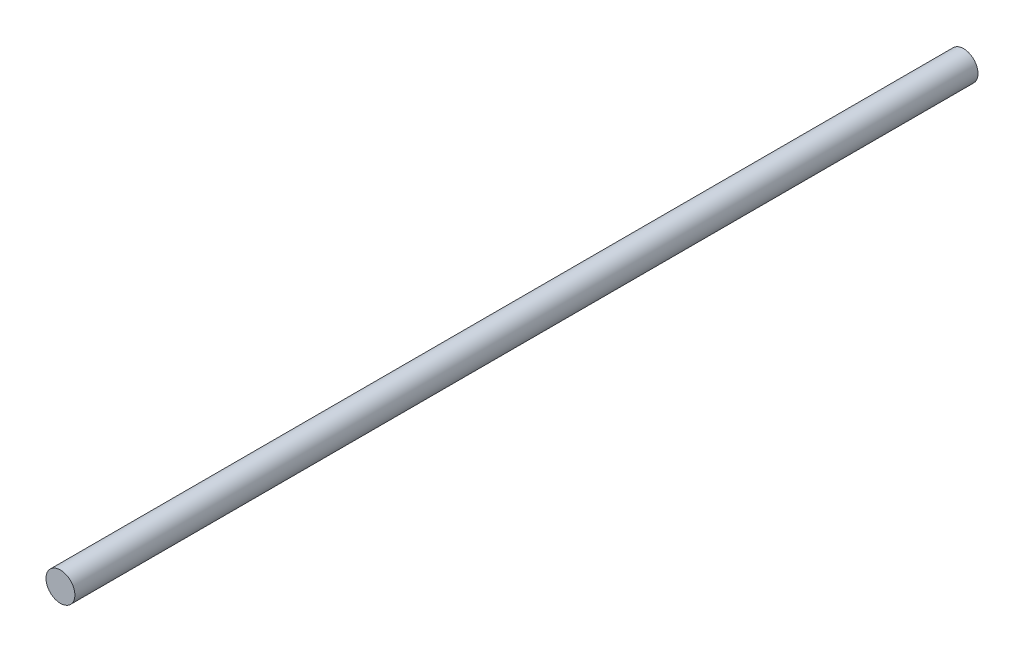
ISO-10303-21;
HEADER;
FILE_DESCRIPTION(('STEP AP214'),'2;1');
FILE_NAME('part.step','',(''),(''),'','','');
FILE_SCHEMA(('AUTOMOTIVE_DESIGN { 1 0 10303 214 1 1 1 1 }'));
ENDSEC;
DATA;
#1=APPLICATION_CONTEXT('core data for automotive mechanical design processes');
#2=APPLICATION_PROTOCOL_DEFINITION('international standard','automotive_design',2000,#1);
#3=PRODUCT_CONTEXT('',#1,'mechanical');
#4=PRODUCT('Part','Part','',(#3));
#5=PRODUCT_RELATED_PRODUCT_CATEGORY('part','',(#4));
#6=PRODUCT_DEFINITION_FORMATION('','',#4);
#7=PRODUCT_DEFINITION_CONTEXT('part definition',#1,'design');
#8=PRODUCT_DEFINITION('design','',#6,#7);
#9=PRODUCT_DEFINITION_SHAPE('','',#8);
#10=(LENGTH_UNIT() NAMED_UNIT(*) SI_UNIT(.MILLI.,.METRE.));
#11=(NAMED_UNIT(*) PLANE_ANGLE_UNIT() SI_UNIT($,.RADIAN.));
#12=(NAMED_UNIT(*) SI_UNIT($,.STERADIAN.) SOLID_ANGLE_UNIT());
#13=UNCERTAINTY_MEASURE_WITH_UNIT(LENGTH_MEASURE(1.E-05),#10,'distance_accuracy_value','');
#14=(GEOMETRIC_REPRESENTATION_CONTEXT(3) GLOBAL_UNCERTAINTY_ASSIGNED_CONTEXT((#13)) GLOBAL_UNIT_ASSIGNED_CONTEXT((#10,
#11,#12)) REPRESENTATION_CONTEXT('',''));
#15=CARTESIAN_POINT('',(0.,0.,0.));
#16=DIRECTION('',(0.,0.,1.));
#17=DIRECTION('',(1.,0.,0.));
#18=AXIS2_PLACEMENT_3D('',#15,#16,#17);
#19=CARTESIAN_POINT('',(0.,0.,250.));
#20=DIRECTION('',(0.,0.,-1.));
#21=DIRECTION('',(-1.,0.,0.));
#22=AXIS2_PLACEMENT_3D('',#19,#20,#21);
#23=CYLINDRICAL_SURFACE('',#22,4.);
#24=CARTESIAN_POINT('',(0.,0.,250.));
#25=DIRECTION('',(0.,0.,1.));
#26=DIRECTION('',(1.,0.,0.));
#27=AXIS2_PLACEMENT_3D('',#24,#25,#26);
#28=CIRCLE('',#27,4.);
#29=CARTESIAN_POINT('',(4.,0.,250.));
#30=VERTEX_POINT('',#29);
#31=EDGE_CURVE('E10',#30,#30,#28,.T.);
#32=ORIENTED_EDGE('',*,*,#31,.F.);
#33=EDGE_LOOP('',(#32));
#34=FACE_BOUND('',#33,.T.);
#35=CARTESIAN_POINT('',(0.,0.,0.));
#36=DIRECTION('',(0.,0.,1.));
#37=DIRECTION('',(1.,0.,0.));
#38=AXIS2_PLACEMENT_3D('',#35,#36,#37);
#39=CIRCLE('',#38,4.);
#40=CARTESIAN_POINT('',(4.,0.,0.));
#41=VERTEX_POINT('',#40);
#42=EDGE_CURVE('E33',#41,#41,#39,.T.);
#43=ORIENTED_EDGE('',*,*,#42,.T.);
#44=EDGE_LOOP('',(#43));
#45=FACE_BOUND('',#44,.T.);
#46=ADVANCED_FACE('F30',(#34,#45),#23,.T.);
#47=CARTESIAN_POINT('',(0.,0.,250.));
#48=DIRECTION('',(0.,0.,1.));
#49=DIRECTION('',(1.,0.,0.));
#50=AXIS2_PLACEMENT_3D('',#47,#48,#49);
#51=PLANE('',#50);
#52=ORIENTED_EDGE('',*,*,#31,.T.);
#53=EDGE_LOOP('',(#52));
#54=FACE_BOUND('',#53,.T.);
#55=ADVANCED_FACE('F45',(#54),#51,.T.);
#56=CARTESIAN_POINT('',(0.,0.,0.));
#57=DIRECTION('',(0.,0.,1.));
#58=DIRECTION('',(1.,0.,0.));
#59=AXIS2_PLACEMENT_3D('',#56,#57,#58);
#60=PLANE('',#59);
#61=ORIENTED_EDGE('',*,*,#42,.F.);
#62=EDGE_LOOP('',(#61));
#63=FACE_BOUND('',#62,.T.);
#64=ADVANCED_FACE('F43',(#63),#60,.F.);
#65=CLOSED_SHELL('',(#46,#55,#64));
#66=MANIFOLD_SOLID_BREP('B2',#65);
#67=ADVANCED_BREP_SHAPE_REPRESENTATION('',(#18,#66),#14);
#68=SHAPE_DEFINITION_REPRESENTATION(#9,#67);
ENDSEC;
END-ISO-10303-21;
